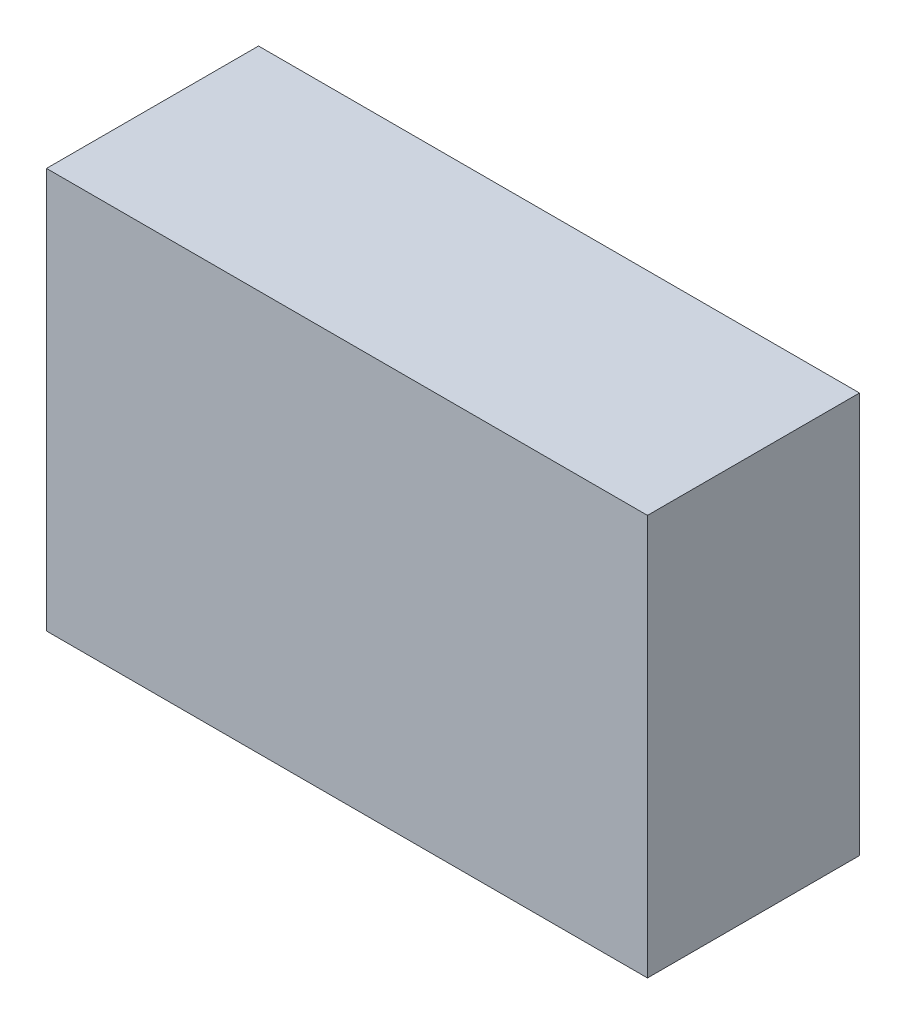
ISO-10303-21;
HEADER;
FILE_DESCRIPTION(('STEP AP214'),'2;1');
FILE_NAME('part.step','',(''),(''),'','','');
FILE_SCHEMA(('AUTOMOTIVE_DESIGN { 1 0 10303 214 1 1 1 1 }'));
ENDSEC;
DATA;
#1=APPLICATION_CONTEXT('core data for automotive mechanical design processes');
#2=APPLICATION_PROTOCOL_DEFINITION('international standard','automotive_design',2000,#1);
#3=PRODUCT_CONTEXT('',#1,'mechanical');
#4=PRODUCT('Part','Part','',(#3));
#5=PRODUCT_RELATED_PRODUCT_CATEGORY('part','',(#4));
#6=PRODUCT_DEFINITION_FORMATION('','',#4);
#7=PRODUCT_DEFINITION_CONTEXT('part definition',#1,'design');
#8=PRODUCT_DEFINITION('design','',#6,#7);
#9=PRODUCT_DEFINITION_SHAPE('','',#8);
#10=(LENGTH_UNIT() NAMED_UNIT(*) SI_UNIT(.MILLI.,.METRE.));
#11=(NAMED_UNIT(*) PLANE_ANGLE_UNIT() SI_UNIT($,.RADIAN.));
#12=(NAMED_UNIT(*) SI_UNIT($,.STERADIAN.) SOLID_ANGLE_UNIT());
#13=UNCERTAINTY_MEASURE_WITH_UNIT(LENGTH_MEASURE(1.E-05),#10,'distance_accuracy_value','');
#14=(GEOMETRIC_REPRESENTATION_CONTEXT(3) GLOBAL_UNCERTAINTY_ASSIGNED_CONTEXT((#13)) GLOBAL_UNIT_ASSIGNED_CONTEXT((#10,
#11,#12)) REPRESENTATION_CONTEXT('',''));
#15=CARTESIAN_POINT('',(0.,0.,0.));
#16=DIRECTION('',(0.,0.,1.));
#17=DIRECTION('',(1.,0.,0.));
#18=AXIS2_PLACEMENT_3D('',#15,#16,#17);
#19=CARTESIAN_POINT('',(-9.00000000000001,88.5,-27.9833076527839));
#20=DIRECTION('',(-1.,0.,0.));
#21=DIRECTION('',(0.,-1.,0.));
#22=AXIS2_PLACEMENT_3D('',#19,#20,#21);
#23=PLANE('',#22);
#24=DIRECTION('',(0.,1.,0.));
#25=VECTOR('',#24,1.);
#26=CARTESIAN_POINT('',(-9.00000000000001,88.5,-6.35));
#27=LINE('',#26,#25);
#28=CARTESIAN_POINT('',(-9.00000000000001,76.5,-6.35));
#29=VERTEX_POINT('',#28);
#30=CARTESIAN_POINT('',(-9.00000000000001,88.5,-6.35));
#31=VERTEX_POINT('',#30);
#32=EDGE_CURVE('E49',#29,#31,#27,.T.);
#33=ORIENTED_EDGE('',*,*,#32,.F.);
#34=DIRECTION('',(0.,0.,1.));
#35=VECTOR('',#34,1.);
#36=CARTESIAN_POINT('',(-9.00000000000001,76.5,-27.9833076527839));
#37=LINE('',#36,#35);
#38=CARTESIAN_POINT('',(-9.00000000000001,76.5,0.));
#39=VERTEX_POINT('',#38);
#40=EDGE_CURVE('E77',#29,#39,#37,.T.);
#41=ORIENTED_EDGE('',*,*,#40,.T.);
#42=DIRECTION('',(0.,-1.,0.));
#43=VECTOR('',#42,1.);
#44=CARTESIAN_POINT('',(-9.00000000000001,88.5,0.));
#45=LINE('',#44,#43);
#46=CARTESIAN_POINT('',(-9.00000000000001,88.5,0.));
#47=VERTEX_POINT('',#46);
#48=EDGE_CURVE('E81',#47,#39,#45,.T.);
#49=ORIENTED_EDGE('',*,*,#48,.F.);
#50=DIRECTION('',(0.,0.,1.));
#51=VECTOR('',#50,1.);
#52=CARTESIAN_POINT('',(-9.00000000000001,88.5,-27.9833076527839));
#53=LINE('',#52,#51);
#54=EDGE_CURVE('E104',#31,#47,#53,.T.);
#55=ORIENTED_EDGE('',*,*,#54,.F.);
#56=EDGE_LOOP('',(#33,#41,#49,#55));
#57=FACE_BOUND('',#56,.T.);
#58=ADVANCED_FACE('F41',(#57),#23,.T.);
#59=CARTESIAN_POINT('',(8.99999999999998,88.5,-27.9833076527839));
#60=DIRECTION('',(0.,1.,0.));
#61=DIRECTION('',(0.,0.,1.));
#62=AXIS2_PLACEMENT_3D('',#59,#60,#61);
#63=PLANE('',#62);
#64=DIRECTION('',(1.,0.,0.));
#65=VECTOR('',#64,1.);
#66=CARTESIAN_POINT('',(8.99999999999998,88.5,-6.35));
#67=LINE('',#66,#65);
#68=CARTESIAN_POINT('',(8.99999999999998,88.5,-6.35));
#69=VERTEX_POINT('',#68);
#70=EDGE_CURVE('E55',#31,#69,#67,.T.);
#71=ORIENTED_EDGE('',*,*,#70,.F.);
#72=ORIENTED_EDGE('',*,*,#54,.T.);
#73=DIRECTION('',(-1.,0.,0.));
#74=VECTOR('',#73,1.);
#75=CARTESIAN_POINT('',(8.99999999999998,88.5,0.));
#76=LINE('',#75,#74);
#77=CARTESIAN_POINT('',(8.99999999999998,88.5,0.));
#78=VERTEX_POINT('',#77);
#79=EDGE_CURVE('E86',#78,#47,#76,.T.);
#80=ORIENTED_EDGE('',*,*,#79,.F.);
#81=DIRECTION('',(0.,0.,1.));
#82=VECTOR('',#81,1.);
#83=CARTESIAN_POINT('',(8.99999999999998,88.5,-27.9833076527839));
#84=LINE('',#83,#82);
#85=EDGE_CURVE('E107',#69,#78,#84,.T.);
#86=ORIENTED_EDGE('',*,*,#85,.F.);
#87=EDGE_LOOP('',(#71,#72,#80,#86));
#88=FACE_BOUND('',#87,.T.);
#89=ADVANCED_FACE('F113',(#88),#63,.T.);
#90=CARTESIAN_POINT('',(8.99999999999999,76.5,-27.9833076527839));
#91=DIRECTION('',(1.,0.,0.));
#92=DIRECTION('',(0.,1.,0.));
#93=AXIS2_PLACEMENT_3D('',#90,#91,#92);
#94=PLANE('',#93);
#95=DIRECTION('',(0.,-1.,0.));
#96=VECTOR('',#95,1.);
#97=CARTESIAN_POINT('',(8.99999999999999,76.5,-6.35));
#98=LINE('',#97,#96);
#99=CARTESIAN_POINT('',(8.99999999999999,76.5,-6.35));
#100=VERTEX_POINT('',#99);
#101=EDGE_CURVE('E106',#69,#100,#98,.T.);
#102=ORIENTED_EDGE('',*,*,#101,.F.);
#103=ORIENTED_EDGE('',*,*,#85,.T.);
#104=DIRECTION('',(0.,1.,0.));
#105=VECTOR('',#104,1.);
#106=CARTESIAN_POINT('',(8.99999999999999,76.5,0.));
#107=LINE('',#106,#105);
#108=CARTESIAN_POINT('',(8.99999999999999,76.5,0.));
#109=VERTEX_POINT('',#108);
#110=EDGE_CURVE('E94',#109,#78,#107,.T.);
#111=ORIENTED_EDGE('',*,*,#110,.F.);
#112=DIRECTION('',(0.,0.,1.));
#113=VECTOR('',#112,1.);
#114=CARTESIAN_POINT('',(8.99999999999999,76.5,-27.9833076527839));
#115=LINE('',#114,#113);
#116=EDGE_CURVE('E85',#100,#109,#115,.T.);
#117=ORIENTED_EDGE('',*,*,#116,.F.);
#118=EDGE_LOOP('',(#102,#103,#111,#117));
#119=FACE_BOUND('',#118,.T.);
#120=ADVANCED_FACE('F111',(#119),#94,.T.);
#121=CARTESIAN_POINT('',(-9.00000000000001,76.5,-27.9833076527839));
#122=DIRECTION('',(0.,-1.,0.));
#123=DIRECTION('',(0.,0.,-1.));
#124=AXIS2_PLACEMENT_3D('',#121,#122,#123);
#125=PLANE('',#124);
#126=DIRECTION('',(-1.,0.,0.));
#127=VECTOR('',#126,1.);
#128=CARTESIAN_POINT('',(-9.00000000000001,76.5,-6.35));
#129=LINE('',#128,#127);
#130=EDGE_CURVE('E11',#100,#29,#129,.T.);
#131=ORIENTED_EDGE('',*,*,#130,.F.);
#132=ORIENTED_EDGE('',*,*,#116,.T.);
#133=DIRECTION('',(1.,0.,0.));
#134=VECTOR('',#133,1.);
#135=CARTESIAN_POINT('',(-9.00000000000001,76.5,0.));
#136=LINE('',#135,#134);
#137=EDGE_CURVE('E88',#39,#109,#136,.T.);
#138=ORIENTED_EDGE('',*,*,#137,.F.);
#139=ORIENTED_EDGE('',*,*,#40,.F.);
#140=EDGE_LOOP('',(#131,#132,#138,#139));
#141=FACE_BOUND('',#140,.T.);
#142=ADVANCED_FACE('F89',(#141),#125,.T.);
#143=CARTESIAN_POINT('',(0.,0.,0.));
#144=DIRECTION('',(0.,0.,1.));
#145=DIRECTION('',(1.,0.,0.));
#146=AXIS2_PLACEMENT_3D('',#143,#144,#145);
#147=PLANE('',#146);
#148=ORIENTED_EDGE('',*,*,#48,.T.);
#149=ORIENTED_EDGE('',*,*,#137,.T.);
#150=ORIENTED_EDGE('',*,*,#110,.T.);
#151=ORIENTED_EDGE('',*,*,#79,.T.);
#152=EDGE_LOOP('',(#148,#149,#150,#151));
#153=FACE_BOUND('',#152,.T.);
#154=ADVANCED_FACE('F96',(#153),#147,.T.);
#155=CARTESIAN_POINT('',(0.,0.,-6.35));
#156=DIRECTION('',(0.,0.,1.));
#157=DIRECTION('',(1.,0.,0.));
#158=AXIS2_PLACEMENT_3D('',#155,#156,#157);
#159=PLANE('',#158);
#160=ORIENTED_EDGE('',*,*,#32,.T.);
#161=ORIENTED_EDGE('',*,*,#70,.T.);
#162=ORIENTED_EDGE('',*,*,#101,.T.);
#163=ORIENTED_EDGE('',*,*,#130,.T.);
#164=EDGE_LOOP('',(#160,#161,#162,#163));
#165=FACE_BOUND('',#164,.T.);
#166=ADVANCED_FACE('F115',(#165),#159,.F.);
#167=CLOSED_SHELL('',(#58,#89,#120,#142,#154,#166));
#168=MANIFOLD_SOLID_BREP('B2',#167);
#169=ADVANCED_BREP_SHAPE_REPRESENTATION('',(#18,#168),#14);
#170=SHAPE_DEFINITION_REPRESENTATION(#9,#169);
ENDSEC;
END-ISO-10303-21;
